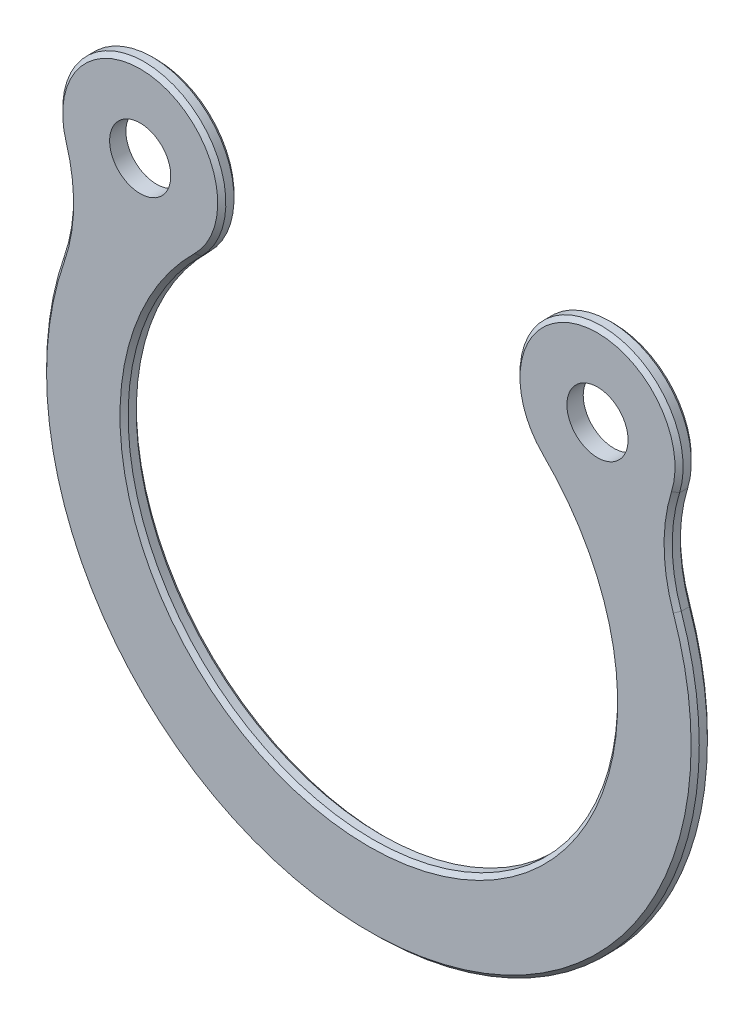
ISO-10303-21;
HEADER;
FILE_DESCRIPTION(('STEP AP214'),'2;1');
FILE_NAME('part.step','',(''),(''),'','','');
FILE_SCHEMA(('AUTOMOTIVE_DESIGN { 1 0 10303 214 1 1 1 1 }'));
ENDSEC;
DATA;
#1=APPLICATION_CONTEXT('core data for automotive mechanical design processes');
#2=APPLICATION_PROTOCOL_DEFINITION('international standard','automotive_design',2000,#1);
#3=PRODUCT_CONTEXT('',#1,'mechanical');
#4=PRODUCT('Part','Part','',(#3));
#5=PRODUCT_RELATED_PRODUCT_CATEGORY('part','',(#4));
#6=PRODUCT_DEFINITION_FORMATION('','',#4);
#7=PRODUCT_DEFINITION_CONTEXT('part definition',#1,'design');
#8=PRODUCT_DEFINITION('design','',#6,#7);
#9=PRODUCT_DEFINITION_SHAPE('','',#8);
#10=(LENGTH_UNIT() NAMED_UNIT(*) SI_UNIT(.MILLI.,.METRE.));
#11=(NAMED_UNIT(*) PLANE_ANGLE_UNIT() SI_UNIT($,.RADIAN.));
#12=(NAMED_UNIT(*) SI_UNIT($,.STERADIAN.) SOLID_ANGLE_UNIT());
#13=UNCERTAINTY_MEASURE_WITH_UNIT(LENGTH_MEASURE(1.E-05),#10,'distance_accuracy_value','');
#14=(GEOMETRIC_REPRESENTATION_CONTEXT(3) GLOBAL_UNCERTAINTY_ASSIGNED_CONTEXT((#13)) GLOBAL_UNIT_ASSIGNED_CONTEXT((#10,
#11,#12)) REPRESENTATION_CONTEXT('',''));
#15=CARTESIAN_POINT('',(0.,0.,0.));
#16=DIRECTION('',(0.,0.,1.));
#17=DIRECTION('',(1.,0.,0.));
#18=AXIS2_PLACEMENT_3D('',#15,#16,#17);
#19=CARTESIAN_POINT('',(22.6735387385767,7.86833153027146,-0.1));
#20=DIRECTION('',(0.,0.,1.));
#21=DIRECTION('',(-0.955289202585222,0.295673027894143,0.));
#22=AXIS2_PLACEMENT_3D('',#19,#20,#21);
#23=CONICAL_SURFACE('',#22,8.10000000000485,0.785398163397455);
#24=DIRECTION('',(0.668025541480977,0.231822940903283,-0.707106781186548));
#25=VECTOR('',#24,1.);
#26=CARTESIAN_POINT('',(14.9267463362251,5.17998492409379,0.));
#27=LINE('',#26,#25);
#28=CARTESIAN_POINT('',(14.9267463362251,5.17998492409379,0.));
#29=VERTEX_POINT('',#28);
#30=CARTESIAN_POINT('',(15.1156924923799,5.24555435351272,-0.2));
#31=VERTEX_POINT('',#30);
#32=EDGE_CURVE('E10',#29,#31,#27,.T.);
#33=ORIENTED_EDGE('',*,*,#32,.T.);
#34=CARTESIAN_POINT('',(22.6735387385767,7.86833153027146,-0.2));
#35=DIRECTION('',(0.,0.,-1.));
#36=DIRECTION('',(-0.955289202585222,0.295673027894143,0.));
#37=AXIS2_PLACEMENT_3D('',#34,#35,#36);
#38=CIRCLE('',#37,8.00000000000485);
#39=CARTESIAN_POINT('',(15.0312251178903,10.233715753426,-0.2));
#40=VERTEX_POINT('',#39);
#41=EDGE_CURVE('E27',#31,#40,#38,.T.);
#42=ORIENTED_EDGE('',*,*,#41,.T.);
#43=DIRECTION('',(-0.675491473142303,0.209072403037904,0.707106781186546));
#44=VECTOR('',#43,1.);
#45=CARTESIAN_POINT('',(15.0312251178903,10.233715753426,-0.2));
#46=LINE('',#45,#44);
#47=CARTESIAN_POINT('',(14.8401672773732,10.2928503590049,0.));
#48=VERTEX_POINT('',#47);
#49=EDGE_CURVE('E238',#40,#48,#46,.T.);
#50=ORIENTED_EDGE('',*,*,#49,.T.);
#51=CARTESIAN_POINT('',(22.6735387385767,7.86833153027146,0.));
#52=DIRECTION('',(0.,0.,1.));
#53=DIRECTION('',(-0.955289202585222,0.295673027894143,0.));
#54=AXIS2_PLACEMENT_3D('',#51,#52,#53);
#55=CIRCLE('',#54,8.20000000000485);
#56=EDGE_CURVE('E213',#48,#29,#55,.T.);
#57=ORIENTED_EDGE('',*,*,#56,.T.);
#58=EDGE_LOOP('',(#33,#42,#50,#57));
#59=FACE_BOUND('',#58,.T.);
#60=ADVANCED_FACE('F16',(#59),#23,.F.);
#61=CARTESIAN_POINT('',(0.,0.,-0.1));
#62=DIRECTION('',(0.,0.,-1.));
#63=DIRECTION('',(0.,-1.,0.));
#64=AXIS2_PLACEMENT_3D('',#61,#62,#63);
#65=CONICAL_SURFACE('',#64,15.9,0.785398163397449);
#66=ORIENTED_EDGE('',*,*,#32,.F.);
#67=CARTESIAN_POINT('',(0.,0.,0.));
#68=DIRECTION('',(0.,0.,-1.));
#69=DIRECTION('',(1.,0.,0.));
#70=AXIS2_PLACEMENT_3D('',#67,#68,#69);
#71=CIRCLE('',#70,15.8);
#72=CARTESIAN_POINT('',(-14.9267463362296,5.17998492409533,0.));
#73=VERTEX_POINT('',#72);
#74=EDGE_CURVE('E210',#29,#73,#71,.T.);
#75=ORIENTED_EDGE('',*,*,#74,.T.);
#76=DIRECTION('',(-0.668025541480979,0.231822940903272,-0.70710678118655));
#77=VECTOR('',#76,1.);
#78=CARTESIAN_POINT('',(-14.9267463362296,5.17998492409533,0.));
#79=LINE('',#78,#77);
#80=CARTESIAN_POINT('',(-15.1156924923844,5.24555435351426,-0.2));
#81=VERTEX_POINT('',#80);
#82=EDGE_CURVE('E94',#73,#81,#79,.T.);
#83=ORIENTED_EDGE('',*,*,#82,.T.);
#84=CARTESIAN_POINT('',(0.,0.,-0.2));
#85=DIRECTION('',(0.,0.,1.));
#86=DIRECTION('',(1.,0.,0.));
#87=AXIS2_PLACEMENT_3D('',#84,#85,#86);
#88=CIRCLE('',#87,16.);
#89=EDGE_CURVE('E41',#81,#31,#88,.T.);
#90=ORIENTED_EDGE('',*,*,#89,.T.);
#91=EDGE_LOOP('',(#66,#75,#83,#90));
#92=FACE_BOUND('',#91,.T.);
#93=ADVANCED_FACE('F388',(#92),#65,.T.);
#94=CARTESIAN_POINT('',(-22.6735387385769,7.86833153027148,-0.1));
#95=DIRECTION('',(0.,0.,1.));
#96=DIRECTION('',(0.944730780774028,-0.327847147094641,0.));
#97=AXIS2_PLACEMENT_3D('',#94,#95,#96);
#98=CONICAL_SURFACE('',#97,8.10000000000027,0.785398163397451);
#99=DIRECTION('',(-0.675491473142303,-0.209072403037904,-0.707106781186546));
#100=VECTOR('',#99,1.);
#101=CARTESIAN_POINT('',(-14.8401672773778,10.2928503590035,0.));
#102=LINE('',#101,#100);
#103=CARTESIAN_POINT('',(-14.8401672773778,10.2928503590035,0.));
#104=VERTEX_POINT('',#103);
#105=CARTESIAN_POINT('',(-15.0312251178949,10.2337157534247,-0.2));
#106=VERTEX_POINT('',#105);
#107=EDGE_CURVE('E92',#104,#106,#102,.T.);
#108=ORIENTED_EDGE('',*,*,#107,.T.);
#109=CARTESIAN_POINT('',(-22.6735387385769,7.86833153027148,-0.2));
#110=DIRECTION('',(0.,0.,-1.));
#111=DIRECTION('',(0.944730780774028,-0.327847147094641,0.));
#112=AXIS2_PLACEMENT_3D('',#109,#110,#111);
#113=CIRCLE('',#112,8.00000000000027);
#114=EDGE_CURVE('E100',#106,#81,#113,.T.);
#115=ORIENTED_EDGE('',*,*,#114,.T.);
#116=ORIENTED_EDGE('',*,*,#82,.F.);
#117=CARTESIAN_POINT('',(-22.6735387385769,7.86833153027148,0.));
#118=DIRECTION('',(0.,0.,1.));
#119=DIRECTION('',(0.944730780774028,-0.327847147094641,0.));
#120=AXIS2_PLACEMENT_3D('',#117,#118,#119);
#121=CIRCLE('',#120,8.20000000000027);
#122=EDGE_CURVE('E88',#73,#104,#121,.T.);
#123=ORIENTED_EDGE('',*,*,#122,.T.);
#124=EDGE_LOOP('',(#108,#115,#116,#123));
#125=FACE_BOUND('',#124,.T.);
#126=ADVANCED_FACE('F90',(#125),#98,.F.);
#127=CARTESIAN_POINT('',(-11.2100683075527,11.4164078649987,-0.1));
#128=DIRECTION('',(0.,0.,-1.));
#129=DIRECTION('',(0.244669349872853,0.969606574458319,0.));
#130=AXIS2_PLACEMENT_3D('',#127,#128,#129);
#131=CONICAL_SURFACE('',#130,3.9,0.785398163397446);
#132=ORIENTED_EDGE('',*,*,#107,.F.);
#133=CARTESIAN_POINT('',(-11.2100683075527,11.4164078649987,0.));
#134=DIRECTION('',(0.,0.,-1.));
#135=DIRECTION('',(1.,0.,0.));
#136=AXIS2_PLACEMENT_3D('',#133,#134,#135);
#137=CIRCLE('',#136,3.8);
#138=CARTESIAN_POINT('',(-8.54767708454879,8.70501099702232,0.));
#139=VERTEX_POINT('',#138);
#140=EDGE_CURVE('E101',#104,#139,#137,.T.);
#141=ORIENTED_EDGE('',*,*,#140,.T.);
#142=DIRECTION('',(0.495419707357256,-0.504538713640536,-0.70710678118655));
#143=VECTOR('',#142,1.);
#144=CARTESIAN_POINT('',(-8.54767708454879,8.70501099702232,0.));
#145=LINE('',#144,#143);
#146=CARTESIAN_POINT('',(-8.40755123070648,8.56230589870777,-0.2));
#147=VERTEX_POINT('',#146);
#148=EDGE_CURVE('E118',#139,#147,#145,.T.);
#149=ORIENTED_EDGE('',*,*,#148,.T.);
#150=CARTESIAN_POINT('',(-11.2100683075527,11.4164078649987,-0.2));
#151=DIRECTION('',(0.,0.,1.));
#152=DIRECTION('',(1.,0.,0.));
#153=AXIS2_PLACEMENT_3D('',#150,#151,#152);
#154=CIRCLE('',#153,4.);
#155=EDGE_CURVE('E109',#147,#106,#154,.T.);
#156=ORIENTED_EDGE('',*,*,#155,.T.);
#157=EDGE_LOOP('',(#132,#141,#149,#156));
#158=FACE_BOUND('',#157,.T.);
#159=ADVANCED_FACE('F105',(#158),#131,.T.);
#160=CARTESIAN_POINT('',(0.,0.,-0.1));
#161=DIRECTION('',(0.,0.,1.));
#162=DIRECTION('',(-8.94304010217654E-07,-0.9999999999996,0.));
#163=AXIS2_PLACEMENT_3D('',#160,#161,#162);
#164=CONICAL_SURFACE('',#163,12.1,0.785398163397454);
#165=DIRECTION('',(-0.495420609693108,-0.504537827421657,-0.707106781322272));
#166=VECTOR('',#165,1.);
#167=CARTESIAN_POINT('',(8.5476926543876,8.70499570856462,0.));
#168=LINE('',#167,#166);
#169=CARTESIAN_POINT('',(8.5476926543876,8.70499570856462,0.));
#170=VERTEX_POINT('',#169);
#171=CARTESIAN_POINT('',(8.40756654535307,8.56229086093801,-0.2));
#172=VERTEX_POINT('',#171);
#173=EDGE_CURVE('E231',#170,#172,#168,.T.);
#174=ORIENTED_EDGE('',*,*,#173,.T.);
#175=CARTESIAN_POINT('',(0.,0.,-0.2));
#176=DIRECTION('',(0.,0.,-1.));
#177=DIRECTION('',(-1.,0.,0.));
#178=AXIS2_PLACEMENT_3D('',#175,#176,#177);
#179=CIRCLE('',#178,12.);
#180=EDGE_CURVE('E199',#172,#147,#179,.T.);
#181=ORIENTED_EDGE('',*,*,#180,.T.);
#182=ORIENTED_EDGE('',*,*,#148,.F.);
#183=CARTESIAN_POINT('',(0.,0.,0.));
#184=DIRECTION('',(0.,0.,1.));
#185=DIRECTION('',(-1.,0.,0.));
#186=AXIS2_PLACEMENT_3D('',#183,#184,#185);
#187=CIRCLE('',#186,12.2);
#188=EDGE_CURVE('E116',#139,#170,#187,.T.);
#189=ORIENTED_EDGE('',*,*,#188,.T.);
#190=EDGE_LOOP('',(#174,#181,#182,#189));
#191=FACE_BOUND('',#190,.T.);
#192=ADVANCED_FACE('F407',(#191),#164,.F.);
#193=CARTESIAN_POINT('',(11.2100683075527,11.4164078649987,-0.1));
#194=DIRECTION('',(0.,0.,-1.));
#195=DIRECTION('',(-0.244672133793202,0.969605871962975,0.));
#196=AXIS2_PLACEMENT_3D('',#193,#194,#195);
#197=CONICAL_SURFACE('',#196,3.9,0.785398163397447);
#198=ORIENTED_EDGE('',*,*,#173,.F.);
#199=CARTESIAN_POINT('',(11.2100683075527,11.4164078649987,0.));
#200=DIRECTION('',(0.,0.,-1.));
#201=DIRECTION('',(-1.,0.,0.));
#202=AXIS2_PLACEMENT_3D('',#199,#200,#201);
#203=CIRCLE('',#202,3.8);
#204=EDGE_CURVE('E163',#170,#48,#203,.T.);
#205=ORIENTED_EDGE('',*,*,#204,.T.);
#206=ORIENTED_EDGE('',*,*,#49,.F.);
#207=CARTESIAN_POINT('',(11.2100683075527,11.4164078649987,-0.2));
#208=DIRECTION('',(0.,0.,1.));
#209=DIRECTION('',(-1.,0.,0.));
#210=AXIS2_PLACEMENT_3D('',#207,#208,#209);
#211=CIRCLE('',#210,4.);
#212=EDGE_CURVE('E167',#40,#172,#211,.T.);
#213=ORIENTED_EDGE('',*,*,#212,.T.);
#214=EDGE_LOOP('',(#198,#205,#206,#213));
#215=FACE_BOUND('',#214,.T.);
#216=ADVANCED_FACE('F403',(#215),#197,.T.);
#217=CARTESIAN_POINT('',(0.,0.,0.));
#218=DIRECTION('',(0.,0.,-1.));
#219=DIRECTION('',(-8.94303848691646E-07,-0.9999999999996,0.));
#220=AXIS2_PLACEMENT_3D('',#217,#218,#219);
#221=CYLINDRICAL_SURFACE('',#220,12.);
#222=ORIENTED_EDGE('',*,*,#180,.F.);
#223=DIRECTION('',(0.,0.,-1.));
#224=VECTOR('',#223,1.);
#225=CARTESIAN_POINT('',(8.40756654535307,8.56229086093801,0.));
#226=LINE('',#225,#224);
#227=CARTESIAN_POINT('',(8.40756654535307,8.56229086093801,-0.6));
#228=VERTEX_POINT('',#227);
#229=EDGE_CURVE('E190',#172,#228,#226,.T.);
#230=ORIENTED_EDGE('',*,*,#229,.T.);
#231=CARTESIAN_POINT('',(0.,0.,-0.6));
#232=DIRECTION('',(0.,0.,1.));
#233=DIRECTION('',(-1.,0.,0.));
#234=AXIS2_PLACEMENT_3D('',#231,#232,#233);
#235=CIRCLE('',#234,12.);
#236=CARTESIAN_POINT('',(-8.40755123070648,8.56230589870777,-0.6));
#237=VERTEX_POINT('',#236);
#238=EDGE_CURVE('E156',#237,#228,#235,.T.);
#239=ORIENTED_EDGE('',*,*,#238,.F.);
#240=DIRECTION('',(0.,0.,-1.));
#241=VECTOR('',#240,1.);
#242=CARTESIAN_POINT('',(-8.40755123070648,8.56230589870777,0.));
#243=LINE('',#242,#241);
#244=EDGE_CURVE('E254',#147,#237,#243,.T.);
#245=ORIENTED_EDGE('',*,*,#244,.F.);
#246=EDGE_LOOP('',(#222,#230,#239,#245));
#247=FACE_BOUND('',#246,.T.);
#248=ADVANCED_FACE('F399',(#247),#221,.F.);
#249=CARTESIAN_POINT('',(11.2100683075527,11.4164078649987,0.));
#250=DIRECTION('',(0.,0.,-1.));
#251=DIRECTION('',(-0.244671951240641,0.969605918028607,0.));
#252=AXIS2_PLACEMENT_3D('',#249,#250,#251);
#253=CYLINDRICAL_SURFACE('',#252,4.);
#254=ORIENTED_EDGE('',*,*,#212,.F.);
#255=DIRECTION('',(0.,0.,-1.));
#256=VECTOR('',#255,1.);
#257=CARTESIAN_POINT('',(15.0312251178903,10.233715753426,0.));
#258=LINE('',#257,#256);
#259=CARTESIAN_POINT('',(15.0312251178903,10.233715753426,-0.6));
#260=VERTEX_POINT('',#259);
#261=EDGE_CURVE('E172',#40,#260,#258,.T.);
#262=ORIENTED_EDGE('',*,*,#261,.T.);
#263=CARTESIAN_POINT('',(11.2100683075527,11.4164078649987,-0.6));
#264=DIRECTION('',(0.,0.,-1.));
#265=DIRECTION('',(-1.,0.,0.));
#266=AXIS2_PLACEMENT_3D('',#263,#264,#265);
#267=CIRCLE('',#266,4.);
#268=EDGE_CURVE('E20',#228,#260,#267,.T.);
#269=ORIENTED_EDGE('',*,*,#268,.F.);
#270=ORIENTED_EDGE('',*,*,#229,.F.);
#271=EDGE_LOOP('',(#254,#262,#269,#270));
#272=FACE_BOUND('',#271,.T.);
#273=ADVANCED_FACE('F402',(#272),#253,.T.);
#274=CARTESIAN_POINT('',(22.6735387385767,7.86833153027146,0.));
#275=DIRECTION('',(0.,0.,-1.));
#276=DIRECTION('',(-0.955289202585222,0.295673027894143,0.));
#277=AXIS2_PLACEMENT_3D('',#274,#275,#276);
#278=CYLINDRICAL_SURFACE('',#277,8.00000000000485);
#279=ORIENTED_EDGE('',*,*,#41,.F.);
#280=DIRECTION('',(0.,0.,-1.));
#281=VECTOR('',#280,1.);
#282=CARTESIAN_POINT('',(15.1156924923799,5.24555435351272,0.));
#283=LINE('',#282,#281);
#284=CARTESIAN_POINT('',(15.1156924923799,5.24555435351272,-0.6));
#285=VERTEX_POINT('',#284);
#286=EDGE_CURVE('E168',#31,#285,#283,.T.);
#287=ORIENTED_EDGE('',*,*,#286,.T.);
#288=CARTESIAN_POINT('',(22.6735387385767,7.86833153027146,-0.6));
#289=DIRECTION('',(0.,0.,1.));
#290=DIRECTION('',(-0.955289202585222,0.295673027894143,0.));
#291=AXIS2_PLACEMENT_3D('',#288,#289,#290);
#292=CIRCLE('',#291,8.00000000000485);
#293=EDGE_CURVE('E203',#260,#285,#292,.T.);
#294=ORIENTED_EDGE('',*,*,#293,.F.);
#295=ORIENTED_EDGE('',*,*,#261,.F.);
#296=EDGE_LOOP('',(#279,#287,#294,#295));
#297=FACE_BOUND('',#296,.T.);
#298=ADVANCED_FACE('F291',(#297),#278,.F.);
#299=CARTESIAN_POINT('',(0.,-0.291796067500665,0.));
#300=DIRECTION('',(0.,0.,1.));
#301=DIRECTION('',(1.,0.,0.));
#302=AXIS2_PLACEMENT_3D('',#299,#300,#301);
#303=PLANE('',#302);
#304=ORIENTED_EDGE('',*,*,#56,.F.);
#305=ORIENTED_EDGE('',*,*,#204,.F.);
#306=ORIENTED_EDGE('',*,*,#188,.F.);
#307=ORIENTED_EDGE('',*,*,#140,.F.);
#308=ORIENTED_EDGE('',*,*,#122,.F.);
#309=ORIENTED_EDGE('',*,*,#74,.F.);
#310=EDGE_LOOP('',(#304,#305,#306,#307,#308,#309));
#311=FACE_BOUND('',#310,.T.);
#312=CARTESIAN_POINT('',(11.2100683075527,11.4164078649987,0.));
#313=DIRECTION('',(0.,0.,-1.));
#314=DIRECTION('',(1.,0.,0.));
#315=AXIS2_PLACEMENT_3D('',#312,#313,#314);
#316=CIRCLE('',#315,1.5);
#317=CARTESIAN_POINT('',(9.71006830755267,11.4164078649987,0.));
#318=VERTEX_POINT('',#317);
#319=EDGE_CURVE('E173',#318,#318,#316,.T.);
#320=ORIENTED_EDGE('',*,*,#319,.T.);
#321=EDGE_LOOP('',(#320));
#322=FACE_BOUND('',#321,.T.);
#323=CARTESIAN_POINT('',(-11.2100683075527,11.4164078649987,0.));
#324=DIRECTION('',(0.,0.,-1.));
#325=DIRECTION('',(1.,0.,0.));
#326=AXIS2_PLACEMENT_3D('',#323,#324,#325);
#327=CIRCLE('',#326,1.5);
#328=CARTESIAN_POINT('',(-12.7100683075527,11.4164078649987,0.));
#329=VERTEX_POINT('',#328);
#330=EDGE_CURVE('E196',#329,#329,#327,.T.);
#331=ORIENTED_EDGE('',*,*,#330,.T.);
#332=EDGE_LOOP('',(#331));
#333=FACE_BOUND('',#332,.T.);
#334=ADVANCED_FACE('F113',(#311,#322,#333),#303,.T.);
#335=CARTESIAN_POINT('',(22.6735387385767,7.86833153027146,-0.7));
#336=DIRECTION('',(0.,0.,-1.));
#337=DIRECTION('',(-0.955289202585222,0.295673027894143,0.));
#338=AXIS2_PLACEMENT_3D('',#335,#336,#337);
#339=CONICAL_SURFACE('',#338,8.10000000000485,0.785398163397455);
#340=DIRECTION('',(-0.668025541480977,-0.231822940903283,-0.707106781186548));
#341=VECTOR('',#340,1.);
#342=CARTESIAN_POINT('',(15.1156924923799,5.24555435351272,-0.6));
#343=LINE('',#342,#341);
#344=CARTESIAN_POINT('',(14.9267463362251,5.17998492409379,-0.8));
#345=VERTEX_POINT('',#344);
#346=EDGE_CURVE('E127',#285,#345,#343,.T.);
#347=ORIENTED_EDGE('',*,*,#346,.T.);
#348=CARTESIAN_POINT('',(22.6735387385767,7.86833153027146,-0.8));
#349=DIRECTION('',(0.,0.,-1.));
#350=DIRECTION('',(-0.955289202585222,0.295673027894143,0.));
#351=AXIS2_PLACEMENT_3D('',#348,#349,#350);
#352=CIRCLE('',#351,8.20000000000485);
#353=CARTESIAN_POINT('',(14.8401672773732,10.2928503590049,-0.8));
#354=VERTEX_POINT('',#353);
#355=EDGE_CURVE('E174',#345,#354,#352,.T.);
#356=ORIENTED_EDGE('',*,*,#355,.T.);
#357=DIRECTION('',(0.675491473142303,-0.209072403037904,0.707106781186546));
#358=VECTOR('',#357,1.);
#359=CARTESIAN_POINT('',(14.8401672773732,10.2928503590049,-0.8));
#360=LINE('',#359,#358);
#361=EDGE_CURVE('E178',#354,#260,#360,.T.);
#362=ORIENTED_EDGE('',*,*,#361,.T.);
#363=ORIENTED_EDGE('',*,*,#293,.T.);
#364=EDGE_LOOP('',(#347,#356,#362,#363));
#365=FACE_BOUND('',#364,.T.);
#366=ADVANCED_FACE('F274',(#365),#339,.F.);
#367=CARTESIAN_POINT('',(0.,0.,-0.7));
#368=DIRECTION('',(0.,0.,1.));
#369=DIRECTION('',(0.,-1.,0.));
#370=AXIS2_PLACEMENT_3D('',#367,#368,#369);
#371=CONICAL_SURFACE('',#370,15.9,0.785398163397449);
#372=DIRECTION('',(0.668025541480973,-0.231822940903285,-0.707106781186552));
#373=VECTOR('',#372,1.);
#374=CARTESIAN_POINT('',(-15.1156924923844,5.24555435351426,-0.6));
#375=LINE('',#374,#373);
#376=CARTESIAN_POINT('',(-15.1156924923844,5.24555435351426,-0.6));
#377=VERTEX_POINT('',#376);
#378=CARTESIAN_POINT('',(-14.9267463362296,5.17998492409533,-0.8));
#379=VERTEX_POINT('',#378);
#380=EDGE_CURVE('E216',#377,#379,#375,.T.);
#381=ORIENTED_EDGE('',*,*,#380,.T.);
#382=CARTESIAN_POINT('',(0.,0.,-0.8));
#383=DIRECTION('',(0.,0.,1.));
#384=DIRECTION('',(1.,0.,0.));
#385=AXIS2_PLACEMENT_3D('',#382,#383,#384);
#386=CIRCLE('',#385,15.8);
#387=EDGE_CURVE('E220',#379,#345,#386,.T.);
#388=ORIENTED_EDGE('',*,*,#387,.T.);
#389=ORIENTED_EDGE('',*,*,#346,.F.);
#390=CARTESIAN_POINT('',(0.,0.,-0.6));
#391=DIRECTION('',(0.,0.,-1.));
#392=DIRECTION('',(1.,0.,0.));
#393=AXIS2_PLACEMENT_3D('',#390,#391,#392);
#394=CIRCLE('',#393,16.);
#395=EDGE_CURVE('E244',#285,#377,#394,.T.);
#396=ORIENTED_EDGE('',*,*,#395,.T.);
#397=EDGE_LOOP('',(#381,#388,#389,#396));
#398=FACE_BOUND('',#397,.T.);
#399=ADVANCED_FACE('F284',(#398),#371,.T.);
#400=CARTESIAN_POINT('',(-22.6735387385769,7.86833153027148,-0.7));
#401=DIRECTION('',(0.,0.,-1.));
#402=DIRECTION('',(0.944730780774028,-0.327847147094641,0.));
#403=AXIS2_PLACEMENT_3D('',#400,#401,#402);
#404=CONICAL_SURFACE('',#403,8.10000000000027,0.785398163397451);
#405=DIRECTION('',(0.675491473142303,0.209072403037904,-0.707106781186546));
#406=VECTOR('',#405,1.);
#407=CARTESIAN_POINT('',(-15.0312251178949,10.2337157534247,-0.6));
#408=LINE('',#407,#406);
#409=CARTESIAN_POINT('',(-15.0312251178949,10.2337157534247,-0.6));
#410=VERTEX_POINT('',#409);
#411=CARTESIAN_POINT('',(-14.8401672773778,10.2928503590035,-0.8));
#412=VERTEX_POINT('',#411);
#413=EDGE_CURVE('E133',#410,#412,#408,.T.);
#414=ORIENTED_EDGE('',*,*,#413,.T.);
#415=CARTESIAN_POINT('',(-22.6735387385769,7.86833153027148,-0.8));
#416=DIRECTION('',(0.,0.,-1.));
#417=DIRECTION('',(0.944730780774028,-0.327847147094641,0.));
#418=AXIS2_PLACEMENT_3D('',#415,#416,#417);
#419=CIRCLE('',#418,8.20000000000027);
#420=EDGE_CURVE('E129',#412,#379,#419,.T.);
#421=ORIENTED_EDGE('',*,*,#420,.T.);
#422=ORIENTED_EDGE('',*,*,#380,.F.);
#423=CARTESIAN_POINT('',(-22.6735387385769,7.86833153027148,-0.6));
#424=DIRECTION('',(0.,0.,1.));
#425=DIRECTION('',(0.944730780774028,-0.327847147094641,0.));
#426=AXIS2_PLACEMENT_3D('',#423,#424,#425);
#427=CIRCLE('',#426,8.00000000000027);
#428=EDGE_CURVE('E134',#377,#410,#427,.T.);
#429=ORIENTED_EDGE('',*,*,#428,.T.);
#430=EDGE_LOOP('',(#414,#421,#422,#429));
#431=FACE_BOUND('',#430,.T.);
#432=ADVANCED_FACE('F414',(#431),#404,.F.);
#433=CARTESIAN_POINT('',(-11.2100683075527,11.4164078649987,-0.7));
#434=DIRECTION('',(0.,0.,1.));
#435=DIRECTION('',(0.244669349872853,0.969606574458319,0.));
#436=AXIS2_PLACEMENT_3D('',#433,#434,#435);
#437=CONICAL_SURFACE('',#436,3.9,0.785398163397446);
#438=DIRECTION('',(-0.495419707357251,0.504538713640543,-0.707106781186549));
#439=VECTOR('',#438,1.);
#440=CARTESIAN_POINT('',(-8.40755123070648,8.56230589870777,-0.6));
#441=LINE('',#440,#439);
#442=CARTESIAN_POINT('',(-8.54767708454879,8.70501099702232,-0.8));
#443=VERTEX_POINT('',#442);
#444=EDGE_CURVE('E138',#237,#443,#441,.T.);
#445=ORIENTED_EDGE('',*,*,#444,.T.);
#446=CARTESIAN_POINT('',(-11.2100683075527,11.4164078649987,-0.8));
#447=DIRECTION('',(0.,0.,1.));
#448=DIRECTION('',(1.,0.,0.));
#449=AXIS2_PLACEMENT_3D('',#446,#447,#448);
#450=CIRCLE('',#449,3.8);
#451=EDGE_CURVE('E139',#443,#412,#450,.T.);
#452=ORIENTED_EDGE('',*,*,#451,.T.);
#453=ORIENTED_EDGE('',*,*,#413,.F.);
#454=CARTESIAN_POINT('',(-11.2100683075527,11.4164078649987,-0.6));
#455=DIRECTION('',(0.,0.,-1.));
#456=DIRECTION('',(1.,0.,0.));
#457=AXIS2_PLACEMENT_3D('',#454,#455,#456);
#458=CIRCLE('',#457,4.);
#459=EDGE_CURVE('E143',#410,#237,#458,.T.);
#460=ORIENTED_EDGE('',*,*,#459,.T.);
#461=EDGE_LOOP('',(#445,#452,#453,#460));
#462=FACE_BOUND('',#461,.T.);
#463=ADVANCED_FACE('F411',(#462),#437,.T.);
#464=CARTESIAN_POINT('',(0.,0.,-0.7));
#465=DIRECTION('',(0.,0.,-1.));
#466=DIRECTION('',(-8.94304010217654E-07,-0.9999999999996,0.));
#467=AXIS2_PLACEMENT_3D('',#464,#465,#466);
#468=CONICAL_SURFACE('',#467,12.1,0.785398163397454);
#469=DIRECTION('',(0.495420609693108,0.504537827421657,-0.707106781322272));
#470=VECTOR('',#469,1.);
#471=CARTESIAN_POINT('',(8.40756654535307,8.56229086093801,-0.6));
#472=LINE('',#471,#470);
#473=CARTESIAN_POINT('',(8.5476926543876,8.70499570856462,-0.8));
#474=VERTEX_POINT('',#473);
#475=EDGE_CURVE('E147',#228,#474,#472,.T.);
#476=ORIENTED_EDGE('',*,*,#475,.T.);
#477=CARTESIAN_POINT('',(0.,0.,-0.8));
#478=DIRECTION('',(0.,0.,-1.));
#479=DIRECTION('',(-1.,0.,0.));
#480=AXIS2_PLACEMENT_3D('',#477,#478,#479);
#481=CIRCLE('',#480,12.2);
#482=EDGE_CURVE('E151',#474,#443,#481,.T.);
#483=ORIENTED_EDGE('',*,*,#482,.T.);
#484=ORIENTED_EDGE('',*,*,#444,.F.);
#485=ORIENTED_EDGE('',*,*,#238,.T.);
#486=EDGE_LOOP('',(#476,#483,#484,#485));
#487=FACE_BOUND('',#486,.T.);
#488=ADVANCED_FACE('F18',(#487),#468,.F.);
#489=CARTESIAN_POINT('',(11.2100683075527,11.4164078649987,-0.7));
#490=DIRECTION('',(0.,0.,1.));
#491=DIRECTION('',(-0.244672133793203,0.969605871962975,0.));
#492=AXIS2_PLACEMENT_3D('',#489,#490,#491);
#493=CONICAL_SURFACE('',#492,3.9,0.785398163397447);
#494=ORIENTED_EDGE('',*,*,#361,.F.);
#495=CARTESIAN_POINT('',(11.2100683075527,11.4164078649987,-0.8));
#496=DIRECTION('',(0.,0.,1.));
#497=DIRECTION('',(-1.,0.,0.));
#498=AXIS2_PLACEMENT_3D('',#495,#496,#497);
#499=CIRCLE('',#498,3.8);
#500=EDGE_CURVE('E152',#354,#474,#499,.T.);
#501=ORIENTED_EDGE('',*,*,#500,.T.);
#502=ORIENTED_EDGE('',*,*,#475,.F.);
#503=ORIENTED_EDGE('',*,*,#268,.T.);
#504=EDGE_LOOP('',(#494,#501,#502,#503));
#505=FACE_BOUND('',#504,.T.);
#506=ADVANCED_FACE('F351',(#505),#493,.T.);
#507=CARTESIAN_POINT('',(-22.6735387385769,7.86833153027148,0.));
#508=DIRECTION('',(0.,0.,-1.));
#509=DIRECTION('',(0.944730780774028,-0.327847147094641,0.));
#510=AXIS2_PLACEMENT_3D('',#507,#508,#509);
#511=CYLINDRICAL_SURFACE('',#510,8.00000000000027);
#512=ORIENTED_EDGE('',*,*,#114,.F.);
#513=DIRECTION('',(0.,0.,-1.));
#514=VECTOR('',#513,1.);
#515=CARTESIAN_POINT('',(-15.0312251178949,10.2337157534247,0.));
#516=LINE('',#515,#514);
#517=EDGE_CURVE('E179',#106,#410,#516,.T.);
#518=ORIENTED_EDGE('',*,*,#517,.T.);
#519=ORIENTED_EDGE('',*,*,#428,.F.);
#520=DIRECTION('',(0.,0.,-1.));
#521=VECTOR('',#520,1.);
#522=CARTESIAN_POINT('',(-15.1156924923844,5.24555435351426,0.));
#523=LINE('',#522,#521);
#524=EDGE_CURVE('E182',#81,#377,#523,.T.);
#525=ORIENTED_EDGE('',*,*,#524,.F.);
#526=EDGE_LOOP('',(#512,#518,#519,#525));
#527=FACE_BOUND('',#526,.T.);
#528=ADVANCED_FACE('F301',(#527),#511,.F.);
#529=CARTESIAN_POINT('',(0.,0.,0.));
#530=DIRECTION('',(0.,0.,-1.));
#531=DIRECTION('',(0.,-1.,0.));
#532=AXIS2_PLACEMENT_3D('',#529,#530,#531);
#533=CYLINDRICAL_SURFACE('',#532,16.);
#534=ORIENTED_EDGE('',*,*,#89,.F.);
#535=ORIENTED_EDGE('',*,*,#524,.T.);
#536=ORIENTED_EDGE('',*,*,#395,.F.);
#537=ORIENTED_EDGE('',*,*,#286,.F.);
#538=EDGE_LOOP('',(#534,#535,#536,#537));
#539=FACE_BOUND('',#538,.T.);
#540=ADVANCED_FACE('F293',(#539),#533,.T.);
#541=CARTESIAN_POINT('',(0.,-0.291796067500665,-0.8));
#542=DIRECTION('',(0.,0.,1.));
#543=DIRECTION('',(1.,0.,0.));
#544=AXIS2_PLACEMENT_3D('',#541,#542,#543);
#545=PLANE('',#544);
#546=ORIENTED_EDGE('',*,*,#355,.F.);
#547=ORIENTED_EDGE('',*,*,#387,.F.);
#548=ORIENTED_EDGE('',*,*,#420,.F.);
#549=ORIENTED_EDGE('',*,*,#451,.F.);
#550=ORIENTED_EDGE('',*,*,#482,.F.);
#551=ORIENTED_EDGE('',*,*,#500,.F.);
#552=EDGE_LOOP('',(#546,#547,#548,#549,#550,#551));
#553=FACE_BOUND('',#552,.T.);
#554=CARTESIAN_POINT('',(11.2100683075527,11.4164078649987,-0.8));
#555=DIRECTION('',(0.,0.,1.));
#556=DIRECTION('',(1.,0.,0.));
#557=AXIS2_PLACEMENT_3D('',#554,#555,#556);
#558=CIRCLE('',#557,1.5);
#559=CARTESIAN_POINT('',(9.71006830755267,11.4164078649987,-0.8));
#560=VERTEX_POINT('',#559);
#561=EDGE_CURVE('E224',#560,#560,#558,.T.);
#562=ORIENTED_EDGE('',*,*,#561,.T.);
#563=EDGE_LOOP('',(#562));
#564=FACE_BOUND('',#563,.T.);
#565=CARTESIAN_POINT('',(-11.2100683075527,11.4164078649987,-0.8));
#566=DIRECTION('',(0.,0.,1.));
#567=DIRECTION('',(1.,0.,0.));
#568=AXIS2_PLACEMENT_3D('',#565,#566,#567);
#569=CIRCLE('',#568,1.5);
#570=CARTESIAN_POINT('',(-12.7100683075527,11.4164078649987,-0.8));
#571=VERTEX_POINT('',#570);
#572=EDGE_CURVE('E161',#571,#571,#569,.T.);
#573=ORIENTED_EDGE('',*,*,#572,.T.);
#574=EDGE_LOOP('',(#573));
#575=FACE_BOUND('',#574,.T.);
#576=ADVANCED_FACE('F343',(#553,#564,#575),#545,.F.);
#577=CARTESIAN_POINT('',(11.2100683075527,11.4164078649987,0.));
#578=DIRECTION('',(0.,0.,-1.));
#579=DIRECTION('',(1.,0.,0.));
#580=AXIS2_PLACEMENT_3D('',#577,#578,#579);
#581=CYLINDRICAL_SURFACE('',#580,1.5);
#582=ORIENTED_EDGE('',*,*,#561,.F.);
#583=DIRECTION('',(0.,0.,1.));
#584=VECTOR('',#583,1.);
#585=CARTESIAN_POINT('',(9.71006830755267,11.4164078649987,0.));
#586=LINE('',#585,#584);
#587=EDGE_CURVE('E157',#560,#318,#586,.T.);
#588=ORIENTED_EDGE('',*,*,#587,.T.);
#589=ORIENTED_EDGE('',*,*,#319,.F.);
#590=ORIENTED_EDGE('',*,*,#587,.F.);
#591=EDGE_LOOP('',(#582,#588,#589,#590));
#592=FACE_BOUND('',#591,.T.);
#593=ADVANCED_FACE('F366',(#592),#581,.F.);
#594=CARTESIAN_POINT('',(-11.2100683075527,11.4164078649987,0.));
#595=DIRECTION('',(0.,0.,-1.));
#596=DIRECTION('',(1.,0.,0.));
#597=AXIS2_PLACEMENT_3D('',#594,#595,#596);
#598=CYLINDRICAL_SURFACE('',#597,1.5);
#599=ORIENTED_EDGE('',*,*,#572,.F.);
#600=DIRECTION('',(0.,0.,1.));
#601=VECTOR('',#600,1.);
#602=CARTESIAN_POINT('',(-12.7100683075527,11.4164078649987,0.));
#603=LINE('',#602,#601);
#604=EDGE_CURVE('E162',#571,#329,#603,.T.);
#605=ORIENTED_EDGE('',*,*,#604,.T.);
#606=ORIENTED_EDGE('',*,*,#330,.F.);
#607=ORIENTED_EDGE('',*,*,#604,.F.);
#608=EDGE_LOOP('',(#599,#605,#606,#607));
#609=FACE_BOUND('',#608,.T.);
#610=ADVANCED_FACE('F374',(#609),#598,.F.);
#611=CARTESIAN_POINT('',(-11.2100683075527,11.4164078649987,0.));
#612=DIRECTION('',(0.,0.,-1.));
#613=DIRECTION('',(0.244669349872852,0.969606574458319,0.));
#614=AXIS2_PLACEMENT_3D('',#611,#612,#613);
#615=CYLINDRICAL_SURFACE('',#614,4.);
#616=ORIENTED_EDGE('',*,*,#155,.F.);
#617=ORIENTED_EDGE('',*,*,#244,.T.);
#618=ORIENTED_EDGE('',*,*,#459,.F.);
#619=ORIENTED_EDGE('',*,*,#517,.F.);
#620=EDGE_LOOP('',(#616,#617,#618,#619));
#621=FACE_BOUND('',#620,.T.);
#622=ADVANCED_FACE('F434',(#621),#615,.T.);
#623=CLOSED_SHELL('',(#60,#93,#126,#159,#192,#216,#248,#273,#298,#334,#366,#399,#432,#463,#488,
#506,#528,#540,#576,#593,#610,#622));
#624=MANIFOLD_SOLID_BREP('B1',#623);
#625=ADVANCED_BREP_SHAPE_REPRESENTATION('',(#18,#624),#14);
#626=SHAPE_DEFINITION_REPRESENTATION(#9,#625);
ENDSEC;
END-ISO-10303-21;
